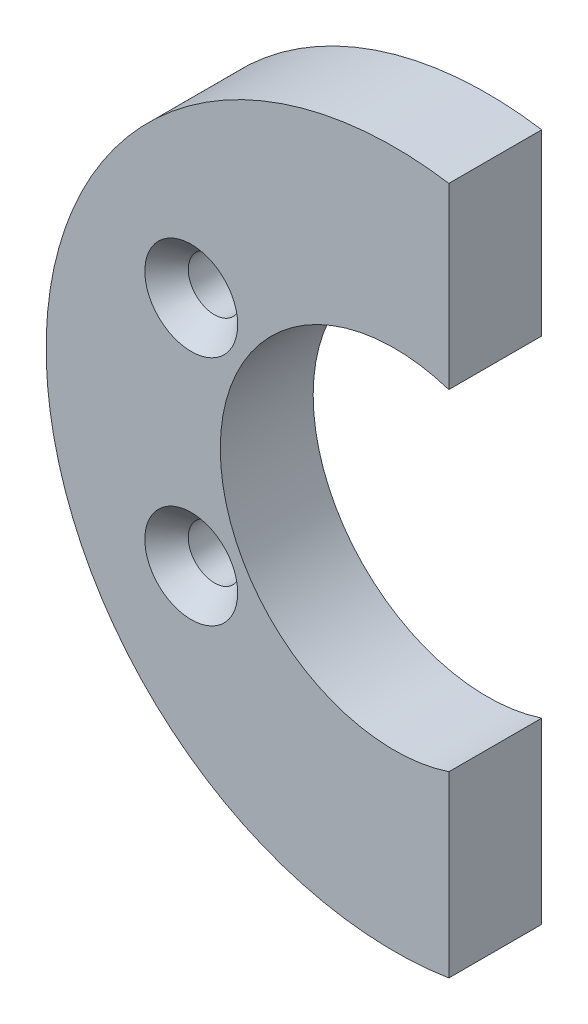
ISO-10303-21;
HEADER;
FILE_DESCRIPTION(('STEP AP214'),'2;1');
FILE_NAME('part.step','',(''),(''),'','','');
FILE_SCHEMA(('AUTOMOTIVE_DESIGN { 1 0 10303 214 1 1 1 1 }'));
ENDSEC;
DATA;
#1=APPLICATION_CONTEXT('core data for automotive mechanical design processes');
#2=APPLICATION_PROTOCOL_DEFINITION('international standard','automotive_design',2000,#1);
#3=PRODUCT_CONTEXT('',#1,'mechanical');
#4=PRODUCT('Part','Part','',(#3));
#5=PRODUCT_RELATED_PRODUCT_CATEGORY('part','',(#4));
#6=PRODUCT_DEFINITION_FORMATION('','',#4);
#7=PRODUCT_DEFINITION_CONTEXT('part definition',#1,'design');
#8=PRODUCT_DEFINITION('design','',#6,#7);
#9=PRODUCT_DEFINITION_SHAPE('','',#8);
#10=(LENGTH_UNIT() NAMED_UNIT(*) SI_UNIT(.MILLI.,.METRE.));
#11=(NAMED_UNIT(*) PLANE_ANGLE_UNIT() SI_UNIT($,.RADIAN.));
#12=(NAMED_UNIT(*) SI_UNIT($,.STERADIAN.) SOLID_ANGLE_UNIT());
#13=UNCERTAINTY_MEASURE_WITH_UNIT(LENGTH_MEASURE(1.E-05),#10,'distance_accuracy_value','');
#14=(GEOMETRIC_REPRESENTATION_CONTEXT(3) GLOBAL_UNCERTAINTY_ASSIGNED_CONTEXT((#13)) GLOBAL_UNIT_ASSIGNED_CONTEXT((#10,
#11,#12)) REPRESENTATION_CONTEXT('',''));
#15=CARTESIAN_POINT('',(0.,0.,0.));
#16=DIRECTION('',(0.,0.,1.));
#17=DIRECTION('',(1.,0.,0.));
#18=AXIS2_PLACEMENT_3D('',#15,#16,#17);
#19=CARTESIAN_POINT('',(0.,0.,5.08));
#20=DIRECTION('',(0.,0.,-1.));
#21=DIRECTION('',(-1.,0.,0.));
#22=AXIS2_PLACEMENT_3D('',#19,#20,#21);
#23=CYLINDRICAL_SURFACE('',#22,9.525);
#24=CARTESIAN_POINT('',(0.,0.,0.));
#25=DIRECTION('',(0.,0.,-1.));
#26=DIRECTION('',(1.,0.,0.));
#27=AXIS2_PLACEMENT_3D('',#24,#25,#26);
#28=CIRCLE('',#27,9.525);
#29=CARTESIAN_POINT('',(2.97359858878864,-9.04894117743917,0.));
#30=VERTEX_POINT('',#29);
#31=CARTESIAN_POINT('',(2.97359858878864,9.04894117743917,0.));
#32=VERTEX_POINT('',#31);
#33=EDGE_CURVE('E97',#30,#32,#28,.T.);
#34=ORIENTED_EDGE('',*,*,#33,.T.);
#35=DIRECTION('',(0.,0.,-1.));
#36=VECTOR('',#35,1.);
#37=CARTESIAN_POINT('',(2.97359858878864,9.04894117743917,5.08));
#38=LINE('',#37,#36);
#39=CARTESIAN_POINT('',(2.97359858878864,9.04894117743917,5.08));
#40=VERTEX_POINT('',#39);
#41=EDGE_CURVE('E11',#40,#32,#38,.T.);
#42=ORIENTED_EDGE('',*,*,#41,.F.);
#43=CARTESIAN_POINT('',(0.,0.,5.08));
#44=DIRECTION('',(0.,0.,-1.));
#45=DIRECTION('',(1.,0.,0.));
#46=AXIS2_PLACEMENT_3D('',#43,#44,#45);
#47=CIRCLE('',#46,9.525);
#48=CARTESIAN_POINT('',(2.97359858878864,-9.04894117743917,5.08));
#49=VERTEX_POINT('',#48);
#50=EDGE_CURVE('E85',#49,#40,#47,.T.);
#51=ORIENTED_EDGE('',*,*,#50,.F.);
#52=DIRECTION('',(0.,0.,-1.));
#53=VECTOR('',#52,1.);
#54=CARTESIAN_POINT('',(2.97359858878864,-9.04894117743917,5.08));
#55=LINE('',#54,#53);
#56=EDGE_CURVE('E93',#49,#30,#55,.T.);
#57=ORIENTED_EDGE('',*,*,#56,.T.);
#58=EDGE_LOOP('',(#34,#42,#51,#57));
#59=FACE_BOUND('',#58,.T.);
#60=ADVANCED_FACE('F34',(#59),#23,.F.);
#61=CARTESIAN_POINT('',(2.97359858878864,18.8164877549652,5.08));
#62=DIRECTION('',(-1.,0.,0.));
#63=DIRECTION('',(0.,0.,1.));
#64=AXIS2_PLACEMENT_3D('',#61,#62,#63);
#65=PLANE('',#64);
#66=DIRECTION('',(0.,1.,0.));
#67=VECTOR('',#66,1.);
#68=CARTESIAN_POINT('',(2.97359858878864,18.8164877549652,0.));
#69=LINE('',#68,#67);
#70=CARTESIAN_POINT('',(2.97359858878864,18.8164877549652,0.));
#71=VERTEX_POINT('',#70);
#72=EDGE_CURVE('E89',#32,#71,#69,.T.);
#73=ORIENTED_EDGE('',*,*,#72,.T.);
#74=DIRECTION('',(0.,0.,-1.));
#75=VECTOR('',#74,1.);
#76=CARTESIAN_POINT('',(2.97359858878864,18.8164877549652,5.08));
#77=LINE('',#76,#75);
#78=CARTESIAN_POINT('',(2.97359858878864,18.8164877549652,5.08));
#79=VERTEX_POINT('',#78);
#80=EDGE_CURVE('E42',#79,#71,#77,.T.);
#81=ORIENTED_EDGE('',*,*,#80,.F.);
#82=DIRECTION('',(0.,1.,0.));
#83=VECTOR('',#82,1.);
#84=CARTESIAN_POINT('',(2.97359858878864,18.8164877549652,5.08));
#85=LINE('',#84,#83);
#86=EDGE_CURVE('E80',#40,#79,#85,.T.);
#87=ORIENTED_EDGE('',*,*,#86,.F.);
#88=ORIENTED_EDGE('',*,*,#41,.T.);
#89=EDGE_LOOP('',(#73,#81,#87,#88));
#90=FACE_BOUND('',#89,.T.);
#91=ADVANCED_FACE('F88',(#90),#65,.F.);
#92=CARTESIAN_POINT('',(0.,0.,5.08));
#93=DIRECTION('',(0.,0.,-1.));
#94=DIRECTION('',(-1.,0.,0.));
#95=AXIS2_PLACEMENT_3D('',#92,#93,#94);
#96=CYLINDRICAL_SURFACE('',#95,19.05);
#97=CARTESIAN_POINT('',(0.,0.,0.));
#98=DIRECTION('',(0.,0.,1.));
#99=DIRECTION('',(1.,0.,0.));
#100=AXIS2_PLACEMENT_3D('',#97,#98,#99);
#101=CIRCLE('',#100,19.05);
#102=CARTESIAN_POINT('',(2.97359858878864,-18.8164877549652,0.));
#103=VERTEX_POINT('',#102);
#104=EDGE_CURVE('E67',#71,#103,#101,.T.);
#105=ORIENTED_EDGE('',*,*,#104,.T.);
#106=DIRECTION('',(0.,0.,-1.));
#107=VECTOR('',#106,1.);
#108=CARTESIAN_POINT('',(2.97359858878864,-18.8164877549652,5.08));
#109=LINE('',#108,#107);
#110=CARTESIAN_POINT('',(2.97359858878864,-18.8164877549652,5.08));
#111=VERTEX_POINT('',#110);
#112=EDGE_CURVE('E90',#111,#103,#109,.T.);
#113=ORIENTED_EDGE('',*,*,#112,.F.);
#114=CARTESIAN_POINT('',(0.,0.,5.08));
#115=DIRECTION('',(0.,0.,1.));
#116=DIRECTION('',(1.,0.,0.));
#117=AXIS2_PLACEMENT_3D('',#114,#115,#116);
#118=CIRCLE('',#117,19.05);
#119=EDGE_CURVE('E83',#79,#111,#118,.T.);
#120=ORIENTED_EDGE('',*,*,#119,.F.);
#121=ORIENTED_EDGE('',*,*,#80,.T.);
#122=EDGE_LOOP('',(#105,#113,#120,#121));
#123=FACE_BOUND('',#122,.T.);
#124=ADVANCED_FACE('F91',(#123),#96,.T.);
#125=CARTESIAN_POINT('',(2.97359858878864,-9.04894117743917,5.08));
#126=DIRECTION('',(-1.,0.,0.));
#127=DIRECTION('',(0.,0.,1.));
#128=AXIS2_PLACEMENT_3D('',#125,#126,#127);
#129=PLANE('',#128);
#130=DIRECTION('',(0.,1.,0.));
#131=VECTOR('',#130,1.);
#132=CARTESIAN_POINT('',(2.97359858878864,-9.04894117743917,0.));
#133=LINE('',#132,#131);
#134=EDGE_CURVE('E73',#103,#30,#133,.T.);
#135=ORIENTED_EDGE('',*,*,#134,.T.);
#136=ORIENTED_EDGE('',*,*,#56,.F.);
#137=DIRECTION('',(0.,1.,0.));
#138=VECTOR('',#137,1.);
#139=CARTESIAN_POINT('',(2.97359858878864,-9.04894117743917,5.08));
#140=LINE('',#139,#138);
#141=EDGE_CURVE('E50',#111,#49,#140,.T.);
#142=ORIENTED_EDGE('',*,*,#141,.F.);
#143=ORIENTED_EDGE('',*,*,#112,.T.);
#144=EDGE_LOOP('',(#135,#136,#142,#143));
#145=FACE_BOUND('',#144,.T.);
#146=ADVANCED_FACE('F105',(#145),#129,.F.);
#147=CARTESIAN_POINT('',(0.,0.,5.08));
#148=DIRECTION('',(0.,0.,1.));
#149=DIRECTION('',(1.,0.,0.));
#150=AXIS2_PLACEMENT_3D('',#147,#148,#149);
#151=PLANE('',#150);
#152=CARTESIAN_POINT('',(-11.1125,6.35,5.08));
#153=DIRECTION('',(0.,0.,1.));
#154=DIRECTION('',(1.,0.,0.));
#155=AXIS2_PLACEMENT_3D('',#152,#153,#154);
#156=CIRCLE('',#155,2.54);
#157=CARTESIAN_POINT('',(-8.5725,6.35,5.08));
#158=VERTEX_POINT('',#157);
#159=EDGE_CURVE('E125',#158,#158,#156,.T.);
#160=ORIENTED_EDGE('',*,*,#159,.F.);
#161=EDGE_LOOP('',(#160));
#162=FACE_BOUND('',#161,.T.);
#163=CARTESIAN_POINT('',(-11.1125,-6.35,5.08));
#164=DIRECTION('',(0.,0.,1.));
#165=DIRECTION('',(1.,0.,0.));
#166=AXIS2_PLACEMENT_3D('',#163,#164,#165);
#167=CIRCLE('',#166,2.54);
#168=CARTESIAN_POINT('',(-8.5725,-6.35,5.08));
#169=VERTEX_POINT('',#168);
#170=EDGE_CURVE('E116',#169,#169,#167,.T.);
#171=ORIENTED_EDGE('',*,*,#170,.F.);
#172=EDGE_LOOP('',(#171));
#173=FACE_BOUND('',#172,.T.);
#174=ORIENTED_EDGE('',*,*,#50,.T.);
#175=ORIENTED_EDGE('',*,*,#86,.T.);
#176=ORIENTED_EDGE('',*,*,#119,.T.);
#177=ORIENTED_EDGE('',*,*,#141,.T.);
#178=EDGE_LOOP('',(#174,#175,#176,#177));
#179=FACE_BOUND('',#178,.T.);
#180=ADVANCED_FACE('F81',(#162,#173,#179),#151,.T.);
#181=CARTESIAN_POINT('',(0.,0.,0.));
#182=DIRECTION('',(0.,0.,1.));
#183=DIRECTION('',(1.,0.,0.));
#184=AXIS2_PLACEMENT_3D('',#181,#182,#183);
#185=PLANE('',#184);
#186=CARTESIAN_POINT('',(-11.1125,6.35,0.));
#187=DIRECTION('',(0.,0.,1.));
#188=DIRECTION('',(1.,0.,0.));
#189=AXIS2_PLACEMENT_3D('',#186,#187,#188);
#190=CIRCLE('',#189,1.4351);
#191=CARTESIAN_POINT('',(-9.6774,6.35,0.));
#192=VERTEX_POINT('',#191);
#193=EDGE_CURVE('E119',#192,#192,#190,.T.);
#194=ORIENTED_EDGE('',*,*,#193,.T.);
#195=EDGE_LOOP('',(#194));
#196=FACE_BOUND('',#195,.T.);
#197=CARTESIAN_POINT('',(-11.1125,-6.35,0.));
#198=DIRECTION('',(0.,0.,1.));
#199=DIRECTION('',(1.,0.,0.));
#200=AXIS2_PLACEMENT_3D('',#197,#198,#199);
#201=CIRCLE('',#200,1.4351);
#202=CARTESIAN_POINT('',(-9.6774,-6.35,0.));
#203=VERTEX_POINT('',#202);
#204=EDGE_CURVE('E100',#203,#203,#201,.T.);
#205=ORIENTED_EDGE('',*,*,#204,.T.);
#206=EDGE_LOOP('',(#205));
#207=FACE_BOUND('',#206,.T.);
#208=ORIENTED_EDGE('',*,*,#33,.F.);
#209=ORIENTED_EDGE('',*,*,#134,.F.);
#210=ORIENTED_EDGE('',*,*,#104,.F.);
#211=ORIENTED_EDGE('',*,*,#72,.F.);
#212=EDGE_LOOP('',(#208,#209,#210,#211));
#213=FACE_BOUND('',#212,.T.);
#214=ADVANCED_FACE('F108',(#196,#207,#213),#185,.F.);
#215=CARTESIAN_POINT('',(-11.1125,-6.35,5.08));
#216=DIRECTION('',(0.,0.,1.));
#217=DIRECTION('',(1.,0.,0.));
#218=AXIS2_PLACEMENT_3D('',#215,#216,#217);
#219=CYLINDRICAL_SURFACE('',#218,1.4351);
#220=ORIENTED_EDGE('',*,*,#204,.F.);
#221=EDGE_LOOP('',(#220));
#222=FACE_BOUND('',#221,.T.);
#223=CARTESIAN_POINT('',(-11.1125,-6.35,3.8089579468615));
#224=DIRECTION('',(0.,0.,1.));
#225=DIRECTION('',(1.,0.,0.));
#226=AXIS2_PLACEMENT_3D('',#223,#224,#225);
#227=CIRCLE('',#226,1.4351);
#228=CARTESIAN_POINT('',(-9.6774,-6.35,3.8089579468615));
#229=VERTEX_POINT('',#228);
#230=EDGE_CURVE('E113',#229,#229,#227,.T.);
#231=ORIENTED_EDGE('',*,*,#230,.T.);
#232=EDGE_LOOP('',(#231));
#233=FACE_BOUND('',#232,.T.);
#234=ADVANCED_FACE('F139',(#222,#233),#219,.F.);
#235=CARTESIAN_POINT('',(-11.1125,-6.35,5.08));
#236=DIRECTION('',(0.,0.,1.));
#237=DIRECTION('',(1.,0.,0.));
#238=AXIS2_PLACEMENT_3D('',#235,#236,#237);
#239=CONICAL_SURFACE('',#238,2.54,0.715584993317674);
#240=ORIENTED_EDGE('',*,*,#230,.F.);
#241=EDGE_LOOP('',(#240));
#242=FACE_BOUND('',#241,.T.);
#243=ORIENTED_EDGE('',*,*,#170,.T.);
#244=EDGE_LOOP('',(#243));
#245=FACE_BOUND('',#244,.T.);
#246=ADVANCED_FACE('F136',(#242,#245),#239,.F.);
#247=CARTESIAN_POINT('',(-11.1125,6.35,5.08));
#248=DIRECTION('',(0.,0.,1.));
#249=DIRECTION('',(1.,0.,0.));
#250=AXIS2_PLACEMENT_3D('',#247,#248,#249);
#251=CYLINDRICAL_SURFACE('',#250,1.4351);
#252=ORIENTED_EDGE('',*,*,#193,.F.);
#253=EDGE_LOOP('',(#252));
#254=FACE_BOUND('',#253,.T.);
#255=CARTESIAN_POINT('',(-11.1125,6.35,3.8089579468615));
#256=DIRECTION('',(0.,0.,1.));
#257=DIRECTION('',(1.,0.,0.));
#258=AXIS2_PLACEMENT_3D('',#255,#256,#257);
#259=CIRCLE('',#258,1.4351);
#260=CARTESIAN_POINT('',(-9.6774,6.35,3.8089579468615));
#261=VERTEX_POINT('',#260);
#262=EDGE_CURVE('E122',#261,#261,#259,.T.);
#263=ORIENTED_EDGE('',*,*,#262,.T.);
#264=EDGE_LOOP('',(#263));
#265=FACE_BOUND('',#264,.T.);
#266=ADVANCED_FACE('F138',(#254,#265),#251,.F.);
#267=CARTESIAN_POINT('',(-11.1125,6.35,5.08));
#268=DIRECTION('',(0.,0.,1.));
#269=DIRECTION('',(1.,0.,0.));
#270=AXIS2_PLACEMENT_3D('',#267,#268,#269);
#271=CONICAL_SURFACE('',#270,2.54,0.715584993317674);
#272=ORIENTED_EDGE('',*,*,#262,.F.);
#273=EDGE_LOOP('',(#272));
#274=FACE_BOUND('',#273,.T.);
#275=ORIENTED_EDGE('',*,*,#159,.T.);
#276=EDGE_LOOP('',(#275));
#277=FACE_BOUND('',#276,.T.);
#278=ADVANCED_FACE('F129',(#274,#277),#271,.F.);
#279=CLOSED_SHELL('',(#60,#91,#124,#146,#180,#214,#234,#246,#266,#278));
#280=MANIFOLD_SOLID_BREP('B2',#279);
#281=ADVANCED_BREP_SHAPE_REPRESENTATION('',(#18,#280),#14);
#282=SHAPE_DEFINITION_REPRESENTATION(#9,#281);
ENDSEC;
END-ISO-10303-21;
